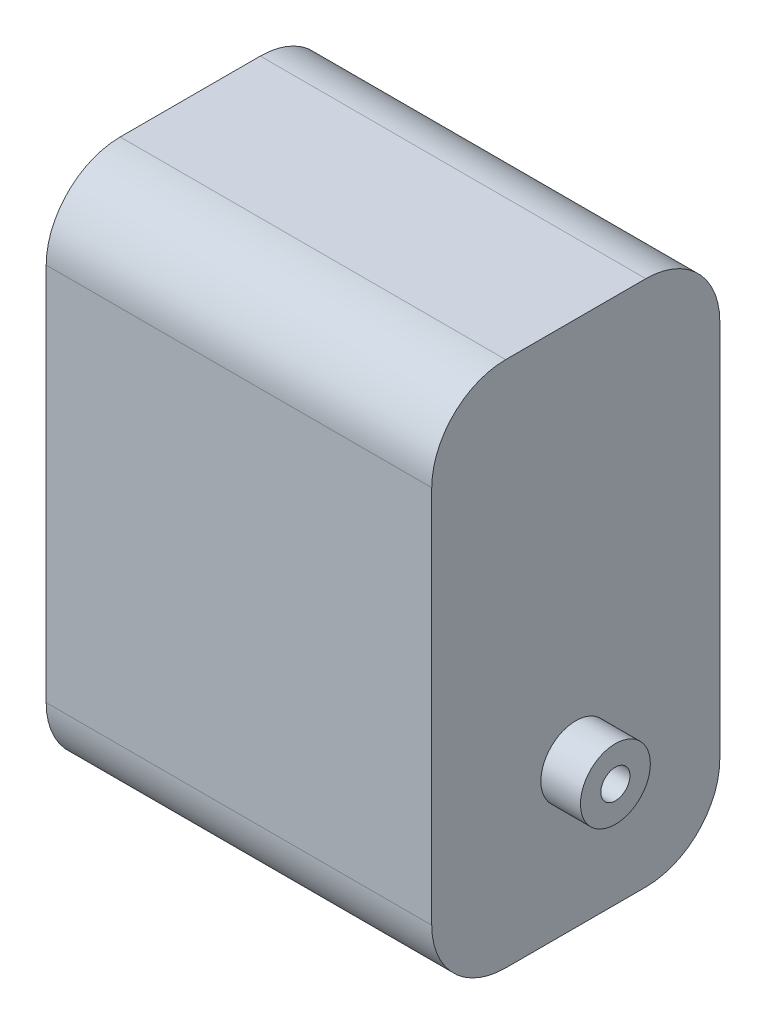
ISO-10303-21;
HEADER;
FILE_DESCRIPTION(('STEP AP214'),'2;1');
FILE_NAME('part.step','',(''),(''),'','','');
FILE_SCHEMA(('AUTOMOTIVE_DESIGN { 1 0 10303 214 1 1 1 1 }'));
ENDSEC;
DATA;
#1=APPLICATION_CONTEXT('core data for automotive mechanical design processes');
#2=APPLICATION_PROTOCOL_DEFINITION('international standard','automotive_design',2000,#1);
#3=PRODUCT_CONTEXT('',#1,'mechanical');
#4=PRODUCT('Part','Part','',(#3));
#5=PRODUCT_RELATED_PRODUCT_CATEGORY('part','',(#4));
#6=PRODUCT_DEFINITION_FORMATION('','',#4);
#7=PRODUCT_DEFINITION_CONTEXT('part definition',#1,'design');
#8=PRODUCT_DEFINITION('design','',#6,#7);
#9=PRODUCT_DEFINITION_SHAPE('','',#8);
#10=(LENGTH_UNIT() NAMED_UNIT(*) SI_UNIT(.MILLI.,.METRE.));
#11=(NAMED_UNIT(*) PLANE_ANGLE_UNIT() SI_UNIT($,.RADIAN.));
#12=(NAMED_UNIT(*) SI_UNIT($,.STERADIAN.) SOLID_ANGLE_UNIT());
#13=UNCERTAINTY_MEASURE_WITH_UNIT(LENGTH_MEASURE(1.E-05),#10,'distance_accuracy_value','');
#14=(GEOMETRIC_REPRESENTATION_CONTEXT(3) GLOBAL_UNCERTAINTY_ASSIGNED_CONTEXT((#13)) GLOBAL_UNIT_ASSIGNED_CONTEXT((#10,
#11,#12)) REPRESENTATION_CONTEXT('',''));
#15=CARTESIAN_POINT('',(0.,0.,0.));
#16=DIRECTION('',(0.,0.,1.));
#17=DIRECTION('',(1.,0.,0.));
#18=AXIS2_PLACEMENT_3D('',#15,#16,#17);
#19=CARTESIAN_POINT('',(33.1,-22.615,-12.365));
#20=DIRECTION('',(0.,0.,1.));
#21=DIRECTION('',(1.,0.,0.));
#22=AXIS2_PLACEMENT_3D('',#19,#20,#21);
#23=PLANE('',#22);
#24=DIRECTION('',(0.,1.,0.));
#25=VECTOR('',#24,1.);
#26=CARTESIAN_POINT('',(0.,-22.615,-12.365));
#27=LINE('',#26,#25);
#28=CARTESIAN_POINT('',(0.,-16.265,-12.365));
#29=VERTEX_POINT('',#28);
#30=CARTESIAN_POINT('',(0.,16.265,-12.365));
#31=VERTEX_POINT('',#30);
#32=EDGE_CURVE('E134',#29,#31,#27,.T.);
#33=ORIENTED_EDGE('',*,*,#32,.T.);
#34=DIRECTION('',(-1.,0.,0.));
#35=VECTOR('',#34,1.);
#36=CARTESIAN_POINT('',(33.1,16.265,-12.365));
#37=LINE('',#36,#35);
#38=CARTESIAN_POINT('',(33.1,16.265,-12.365));
#39=VERTEX_POINT('',#38);
#40=EDGE_CURVE('E109',#31,#39,#37,.F.);
#41=ORIENTED_EDGE('',*,*,#40,.T.);
#42=DIRECTION('',(0.,1.,0.));
#43=VECTOR('',#42,1.);
#44=CARTESIAN_POINT('',(33.1,-22.615,-12.365));
#45=LINE('',#44,#43);
#46=CARTESIAN_POINT('',(33.1,-16.265,-12.365));
#47=VERTEX_POINT('',#46);
#48=EDGE_CURVE('E145',#47,#39,#45,.T.);
#49=ORIENTED_EDGE('',*,*,#48,.F.);
#50=DIRECTION('',(-1.,0.,0.));
#51=VECTOR('',#50,1.);
#52=CARTESIAN_POINT('',(33.1,-16.265,-12.365));
#53=LINE('',#52,#51);
#54=EDGE_CURVE('E114',#47,#29,#53,.T.);
#55=ORIENTED_EDGE('',*,*,#54,.T.);
#56=EDGE_LOOP('',(#33,#41,#49,#55));
#57=FACE_BOUND('',#56,.T.);
#58=ADVANCED_FACE('F39',(#57),#23,.F.);
#59=CARTESIAN_POINT('',(33.1,22.615,12.365));
#60=DIRECTION('',(0.,-1.,0.));
#61=DIRECTION('',(0.,0.,-1.));
#62=AXIS2_PLACEMENT_3D('',#59,#60,#61);
#63=PLANE('',#62);
#64=DIRECTION('',(0.,0.,1.));
#65=VECTOR('',#64,1.);
#66=CARTESIAN_POINT('',(33.1,22.615,12.365));
#67=LINE('',#66,#65);
#68=CARTESIAN_POINT('',(33.1,22.615,-6.015));
#69=VERTEX_POINT('',#68);
#70=CARTESIAN_POINT('',(33.1,22.615,6.015));
#71=VERTEX_POINT('',#70);
#72=EDGE_CURVE('E123',#69,#71,#67,.T.);
#73=ORIENTED_EDGE('',*,*,#72,.F.);
#74=DIRECTION('',(-1.,0.,0.));
#75=VECTOR('',#74,1.);
#76=CARTESIAN_POINT('',(33.1,22.615,-6.015));
#77=LINE('',#76,#75);
#78=CARTESIAN_POINT('',(0.,22.615,-6.015));
#79=VERTEX_POINT('',#78);
#80=EDGE_CURVE('E107',#69,#79,#77,.T.);
#81=ORIENTED_EDGE('',*,*,#80,.T.);
#82=DIRECTION('',(0.,0.,1.));
#83=VECTOR('',#82,1.);
#84=CARTESIAN_POINT('',(0.,22.615,12.365));
#85=LINE('',#84,#83);
#86=CARTESIAN_POINT('',(0.,22.615,6.015));
#87=VERTEX_POINT('',#86);
#88=EDGE_CURVE('E125',#79,#87,#85,.T.);
#89=ORIENTED_EDGE('',*,*,#88,.T.);
#90=DIRECTION('',(-1.,0.,0.));
#91=VECTOR('',#90,1.);
#92=CARTESIAN_POINT('',(33.1,22.615,6.015));
#93=LINE('',#92,#91);
#94=EDGE_CURVE('E130',#87,#71,#93,.F.);
#95=ORIENTED_EDGE('',*,*,#94,.T.);
#96=EDGE_LOOP('',(#73,#81,#89,#95));
#97=FACE_BOUND('',#96,.T.);
#98=ADVANCED_FACE('F122',(#97),#63,.F.);
#99=CARTESIAN_POINT('',(33.1,-22.615,12.365));
#100=DIRECTION('',(0.,0.,-1.));
#101=DIRECTION('',(-1.,0.,0.));
#102=AXIS2_PLACEMENT_3D('',#99,#100,#101);
#103=PLANE('',#102);
#104=DIRECTION('',(0.,-1.,0.));
#105=VECTOR('',#104,1.);
#106=CARTESIAN_POINT('',(0.,-22.615,12.365));
#107=LINE('',#106,#105);
#108=CARTESIAN_POINT('',(0.,16.265,12.365));
#109=VERTEX_POINT('',#108);
#110=CARTESIAN_POINT('',(0.,-16.265,12.365));
#111=VERTEX_POINT('',#110);
#112=EDGE_CURVE('E132',#109,#111,#107,.T.);
#113=ORIENTED_EDGE('',*,*,#112,.T.);
#114=DIRECTION('',(-1.,0.,0.));
#115=VECTOR('',#114,1.);
#116=CARTESIAN_POINT('',(33.1,-16.265,12.365));
#117=LINE('',#116,#115);
#118=CARTESIAN_POINT('',(33.1,-16.265,12.365));
#119=VERTEX_POINT('',#118);
#120=EDGE_CURVE('E11',#111,#119,#117,.F.);
#121=ORIENTED_EDGE('',*,*,#120,.T.);
#122=DIRECTION('',(0.,-1.,0.));
#123=VECTOR('',#122,1.);
#124=CARTESIAN_POINT('',(33.1,-22.615,12.365));
#125=LINE('',#124,#123);
#126=CARTESIAN_POINT('',(33.1,16.265,12.365));
#127=VERTEX_POINT('',#126);
#128=EDGE_CURVE('E166',#127,#119,#125,.T.);
#129=ORIENTED_EDGE('',*,*,#128,.F.);
#130=DIRECTION('',(-1.,0.,0.));
#131=VECTOR('',#130,1.);
#132=CARTESIAN_POINT('',(33.1,16.265,12.365));
#133=LINE('',#132,#131);
#134=EDGE_CURVE('E50',#127,#109,#133,.T.);
#135=ORIENTED_EDGE('',*,*,#134,.T.);
#136=EDGE_LOOP('',(#113,#121,#129,#135));
#137=FACE_BOUND('',#136,.T.);
#138=ADVANCED_FACE('F168',(#137),#103,.F.);
#139=CARTESIAN_POINT('',(33.1,-22.615,12.365));
#140=DIRECTION('',(0.,1.,0.));
#141=DIRECTION('',(0.,0.,1.));
#142=AXIS2_PLACEMENT_3D('',#139,#140,#141);
#143=PLANE('',#142);
#144=DIRECTION('',(0.,0.,-1.));
#145=VECTOR('',#144,1.);
#146=CARTESIAN_POINT('',(0.,-22.615,12.365));
#147=LINE('',#146,#145);
#148=CARTESIAN_POINT('',(0.,-22.615,6.015));
#149=VERTEX_POINT('',#148);
#150=CARTESIAN_POINT('',(0.,-22.615,-6.015));
#151=VERTEX_POINT('',#150);
#152=EDGE_CURVE('E133',#149,#151,#147,.T.);
#153=ORIENTED_EDGE('',*,*,#152,.T.);
#154=DIRECTION('',(-1.,0.,0.));
#155=VECTOR('',#154,1.);
#156=CARTESIAN_POINT('',(33.1,-22.615,-6.015));
#157=LINE('',#156,#155);
#158=CARTESIAN_POINT('',(33.1,-22.615,-6.015));
#159=VERTEX_POINT('',#158);
#160=EDGE_CURVE('E53',#151,#159,#157,.F.);
#161=ORIENTED_EDGE('',*,*,#160,.T.);
#162=DIRECTION('',(0.,0.,-1.));
#163=VECTOR('',#162,1.);
#164=CARTESIAN_POINT('',(33.1,-22.615,12.365));
#165=LINE('',#164,#163);
#166=CARTESIAN_POINT('',(33.1,-22.615,6.015));
#167=VERTEX_POINT('',#166);
#168=EDGE_CURVE('E176',#167,#159,#165,.T.);
#169=ORIENTED_EDGE('',*,*,#168,.F.);
#170=DIRECTION('',(-1.,0.,0.));
#171=VECTOR('',#170,1.);
#172=CARTESIAN_POINT('',(33.1,-22.615,6.015));
#173=LINE('',#172,#171);
#174=EDGE_CURVE('E158',#167,#149,#173,.T.);
#175=ORIENTED_EDGE('',*,*,#174,.T.);
#176=EDGE_LOOP('',(#153,#161,#169,#175));
#177=FACE_BOUND('',#176,.T.);
#178=ADVANCED_FACE('F174',(#177),#143,.F.);
#179=CARTESIAN_POINT('',(33.1,0.,0.));
#180=DIRECTION('',(-1.,0.,0.));
#181=DIRECTION('',(0.,0.,1.));
#182=AXIS2_PLACEMENT_3D('',#179,#180,#181);
#183=PLANE('',#182);
#184=CARTESIAN_POINT('',(33.1,-10.245,0.));
#185=DIRECTION('',(1.,0.,0.));
#186=DIRECTION('',(0.,0.,-1.));
#187=AXIS2_PLACEMENT_3D('',#184,#185,#186);
#188=CIRCLE('',#187,3.);
#189=CARTESIAN_POINT('',(33.1,-10.245,-3.));
#190=VERTEX_POINT('',#189);
#191=EDGE_CURVE('E141',#190,#190,#188,.T.);
#192=ORIENTED_EDGE('',*,*,#191,.F.);
#193=EDGE_LOOP('',(#192));
#194=FACE_BOUND('',#193,.T.);
#195=ORIENTED_EDGE('',*,*,#48,.T.);
#196=CARTESIAN_POINT('',(33.1,16.265,-6.015));
#197=DIRECTION('',(-1.,0.,0.));
#198=DIRECTION('',(0.,0.,1.));
#199=AXIS2_PLACEMENT_3D('',#196,#197,#198);
#200=CIRCLE('',#199,6.35);
#201=EDGE_CURVE('E160',#39,#69,#200,.F.);
#202=ORIENTED_EDGE('',*,*,#201,.T.);
#203=ORIENTED_EDGE('',*,*,#72,.T.);
#204=CARTESIAN_POINT('',(33.1,16.265,6.015));
#205=DIRECTION('',(-1.,0.,0.));
#206=DIRECTION('',(0.,0.,1.));
#207=AXIS2_PLACEMENT_3D('',#204,#205,#206);
#208=CIRCLE('',#207,6.35);
#209=EDGE_CURVE('E154',#71,#127,#208,.F.);
#210=ORIENTED_EDGE('',*,*,#209,.T.);
#211=ORIENTED_EDGE('',*,*,#128,.T.);
#212=CARTESIAN_POINT('',(33.1,-16.265,6.015));
#213=DIRECTION('',(-1.,0.,0.));
#214=DIRECTION('',(0.,0.,1.));
#215=AXIS2_PLACEMENT_3D('',#212,#213,#214);
#216=CIRCLE('',#215,6.35);
#217=EDGE_CURVE('E62',#119,#167,#216,.F.);
#218=ORIENTED_EDGE('',*,*,#217,.T.);
#219=ORIENTED_EDGE('',*,*,#168,.T.);
#220=CARTESIAN_POINT('',(33.1,-16.265,-6.015));
#221=DIRECTION('',(-1.,0.,0.));
#222=DIRECTION('',(0.,0.,1.));
#223=AXIS2_PLACEMENT_3D('',#220,#221,#222);
#224=CIRCLE('',#223,6.35);
#225=EDGE_CURVE('E153',#159,#47,#224,.F.);
#226=ORIENTED_EDGE('',*,*,#225,.T.);
#227=EDGE_LOOP('',(#195,#202,#203,#210,#211,#218,#219,#226));
#228=FACE_BOUND('',#227,.T.);
#229=ADVANCED_FACE('F206',(#194,#228),#183,.F.);
#230=CARTESIAN_POINT('',(0.,0.,0.));
#231=DIRECTION('',(-1.,0.,0.));
#232=DIRECTION('',(0.,0.,1.));
#233=AXIS2_PLACEMENT_3D('',#230,#231,#232);
#234=PLANE('',#233);
#235=ORIENTED_EDGE('',*,*,#88,.F.);
#236=CARTESIAN_POINT('',(0.,16.265,-6.015));
#237=DIRECTION('',(-1.,0.,0.));
#238=DIRECTION('',(0.,0.,1.));
#239=AXIS2_PLACEMENT_3D('',#236,#237,#238);
#240=CIRCLE('',#239,6.35);
#241=EDGE_CURVE('E102',#79,#31,#240,.T.);
#242=ORIENTED_EDGE('',*,*,#241,.T.);
#243=ORIENTED_EDGE('',*,*,#32,.F.);
#244=CARTESIAN_POINT('',(0.,-16.265,-6.015));
#245=DIRECTION('',(-1.,0.,0.));
#246=DIRECTION('',(0.,0.,1.));
#247=AXIS2_PLACEMENT_3D('',#244,#245,#246);
#248=CIRCLE('',#247,6.35);
#249=EDGE_CURVE('E116',#29,#151,#248,.T.);
#250=ORIENTED_EDGE('',*,*,#249,.T.);
#251=ORIENTED_EDGE('',*,*,#152,.F.);
#252=CARTESIAN_POINT('',(0.,-16.265,6.015));
#253=DIRECTION('',(-1.,0.,0.));
#254=DIRECTION('',(0.,0.,1.));
#255=AXIS2_PLACEMENT_3D('',#252,#253,#254);
#256=CIRCLE('',#255,6.35);
#257=EDGE_CURVE('E147',#149,#111,#256,.T.);
#258=ORIENTED_EDGE('',*,*,#257,.T.);
#259=ORIENTED_EDGE('',*,*,#112,.F.);
#260=CARTESIAN_POINT('',(0.,16.265,6.015));
#261=DIRECTION('',(-1.,0.,0.));
#262=DIRECTION('',(0.,0.,1.));
#263=AXIS2_PLACEMENT_3D('',#260,#261,#262);
#264=CIRCLE('',#263,6.35);
#265=EDGE_CURVE('E127',#109,#87,#264,.T.);
#266=ORIENTED_EDGE('',*,*,#265,.T.);
#267=EDGE_LOOP('',(#235,#242,#243,#250,#251,#258,#259,#266));
#268=FACE_BOUND('',#267,.T.);
#269=ADVANCED_FACE('F126',(#268),#234,.T.);
#270=CARTESIAN_POINT('',(36.5,-10.245,0.));
#271=DIRECTION('',(1.,0.,0.));
#272=DIRECTION('',(0.,0.,-1.));
#273=AXIS2_PLACEMENT_3D('',#270,#271,#272);
#274=PLANE('',#273);
#275=CARTESIAN_POINT('',(36.5,-10.245,0.));
#276=DIRECTION('',(1.,0.,0.));
#277=DIRECTION('',(0.,0.,-1.));
#278=AXIS2_PLACEMENT_3D('',#275,#276,#277);
#279=CIRCLE('',#278,3.);
#280=CARTESIAN_POINT('',(36.5,-10.245,-3.));
#281=VERTEX_POINT('',#280);
#282=EDGE_CURVE('E137',#281,#281,#279,.T.);
#283=ORIENTED_EDGE('',*,*,#282,.T.);
#284=EDGE_LOOP('',(#283));
#285=FACE_BOUND('',#284,.T.);
#286=CARTESIAN_POINT('',(36.5,-10.245,0.));
#287=DIRECTION('',(1.,0.,0.));
#288=DIRECTION('',(0.,0.,-1.));
#289=AXIS2_PLACEMENT_3D('',#286,#287,#288);
#290=CIRCLE('',#289,1.25);
#291=CARTESIAN_POINT('',(36.5,-10.245,-1.25));
#292=VERTEX_POINT('',#291);
#293=EDGE_CURVE('E190',#292,#292,#290,.T.);
#294=ORIENTED_EDGE('',*,*,#293,.F.);
#295=EDGE_LOOP('',(#294));
#296=FACE_BOUND('',#295,.T.);
#297=ADVANCED_FACE('F199',(#285,#296),#274,.T.);
#298=CARTESIAN_POINT('',(36.5,-10.245,0.));
#299=DIRECTION('',(-1.,0.,0.));
#300=DIRECTION('',(0.,0.,1.));
#301=AXIS2_PLACEMENT_3D('',#298,#299,#300);
#302=CYLINDRICAL_SURFACE('',#301,3.);
#303=ORIENTED_EDGE('',*,*,#282,.F.);
#304=EDGE_LOOP('',(#303));
#305=FACE_BOUND('',#304,.T.);
#306=ORIENTED_EDGE('',*,*,#191,.T.);
#307=EDGE_LOOP('',(#306));
#308=FACE_BOUND('',#307,.T.);
#309=ADVANCED_FACE('F196',(#305,#308),#302,.T.);
#310=CARTESIAN_POINT('',(36.5,-10.245,0.));
#311=DIRECTION('',(-1.,0.,0.));
#312=DIRECTION('',(0.,0.,1.));
#313=AXIS2_PLACEMENT_3D('',#310,#311,#312);
#314=CYLINDRICAL_SURFACE('',#313,1.25);
#315=ORIENTED_EDGE('',*,*,#293,.T.);
#316=EDGE_LOOP('',(#315));
#317=FACE_BOUND('',#316,.T.);
#318=CARTESIAN_POINT('',(33.1,-10.245,0.));
#319=DIRECTION('',(1.,0.,0.));
#320=DIRECTION('',(0.,0.,-1.));
#321=AXIS2_PLACEMENT_3D('',#318,#319,#320);
#322=CIRCLE('',#321,1.25);
#323=CARTESIAN_POINT('',(33.1,-10.245,-1.25));
#324=VERTEX_POINT('',#323);
#325=EDGE_CURVE('E189',#324,#324,#322,.T.);
#326=ORIENTED_EDGE('',*,*,#325,.F.);
#327=EDGE_LOOP('',(#326));
#328=FACE_BOUND('',#327,.T.);
#329=ADVANCED_FACE('F191',(#317,#328),#314,.F.);
#330=ORIENTED_EDGE('',*,*,#325,.T.);
#331=EDGE_LOOP('',(#330));
#332=FACE_BOUND('',#331,.T.);
#333=ADVANCED_FACE('F223',(#332),#183,.F.);
#334=CARTESIAN_POINT('',(33.1,16.265,-6.015));
#335=DIRECTION('',(-1.,0.,0.));
#336=DIRECTION('',(0.,0.,1.));
#337=AXIS2_PLACEMENT_3D('',#334,#335,#336);
#338=CYLINDRICAL_SURFACE('',#337,6.35);
#339=ORIENTED_EDGE('',*,*,#201,.F.);
#340=ORIENTED_EDGE('',*,*,#40,.F.);
#341=ORIENTED_EDGE('',*,*,#241,.F.);
#342=ORIENTED_EDGE('',*,*,#80,.F.);
#343=EDGE_LOOP('',(#339,#340,#341,#342));
#344=FACE_BOUND('',#343,.T.);
#345=ADVANCED_FACE('F108',(#344),#338,.T.);
#346=CARTESIAN_POINT('',(33.1,-16.265,-6.015));
#347=DIRECTION('',(-1.,0.,0.));
#348=DIRECTION('',(0.,0.,1.));
#349=AXIS2_PLACEMENT_3D('',#346,#347,#348);
#350=CYLINDRICAL_SURFACE('',#349,6.35);
#351=ORIENTED_EDGE('',*,*,#225,.F.);
#352=ORIENTED_EDGE('',*,*,#160,.F.);
#353=ORIENTED_EDGE('',*,*,#249,.F.);
#354=ORIENTED_EDGE('',*,*,#54,.F.);
#355=EDGE_LOOP('',(#351,#352,#353,#354));
#356=FACE_BOUND('',#355,.T.);
#357=ADVANCED_FACE('F222',(#356),#350,.T.);
#358=CARTESIAN_POINT('',(33.1,-16.265,6.015));
#359=DIRECTION('',(-1.,0.,0.));
#360=DIRECTION('',(0.,0.,1.));
#361=AXIS2_PLACEMENT_3D('',#358,#359,#360);
#362=CYLINDRICAL_SURFACE('',#361,6.35);
#363=ORIENTED_EDGE('',*,*,#217,.F.);
#364=ORIENTED_EDGE('',*,*,#120,.F.);
#365=ORIENTED_EDGE('',*,*,#257,.F.);
#366=ORIENTED_EDGE('',*,*,#174,.F.);
#367=EDGE_LOOP('',(#363,#364,#365,#366));
#368=FACE_BOUND('',#367,.T.);
#369=ADVANCED_FACE('F172',(#368),#362,.T.);
#370=CARTESIAN_POINT('',(33.1,16.265,6.015));
#371=DIRECTION('',(-1.,0.,0.));
#372=DIRECTION('',(0.,0.,1.));
#373=AXIS2_PLACEMENT_3D('',#370,#371,#372);
#374=CYLINDRICAL_SURFACE('',#373,6.35);
#375=ORIENTED_EDGE('',*,*,#209,.F.);
#376=ORIENTED_EDGE('',*,*,#94,.F.);
#377=ORIENTED_EDGE('',*,*,#265,.F.);
#378=ORIENTED_EDGE('',*,*,#134,.F.);
#379=EDGE_LOOP('',(#375,#376,#377,#378));
#380=FACE_BOUND('',#379,.T.);
#381=ADVANCED_FACE('F41',(#380),#374,.T.);
#382=CLOSED_SHELL('',(#58,#98,#138,#178,#229,#269,#297,#309,#329,#333,#345,#357,#369,#381));
#383=MANIFOLD_SOLID_BREP('B2',#382);
#384=ADVANCED_BREP_SHAPE_REPRESENTATION('',(#18,#383),#14);
#385=SHAPE_DEFINITION_REPRESENTATION(#9,#384);
ENDSEC;
END-ISO-10303-21;
